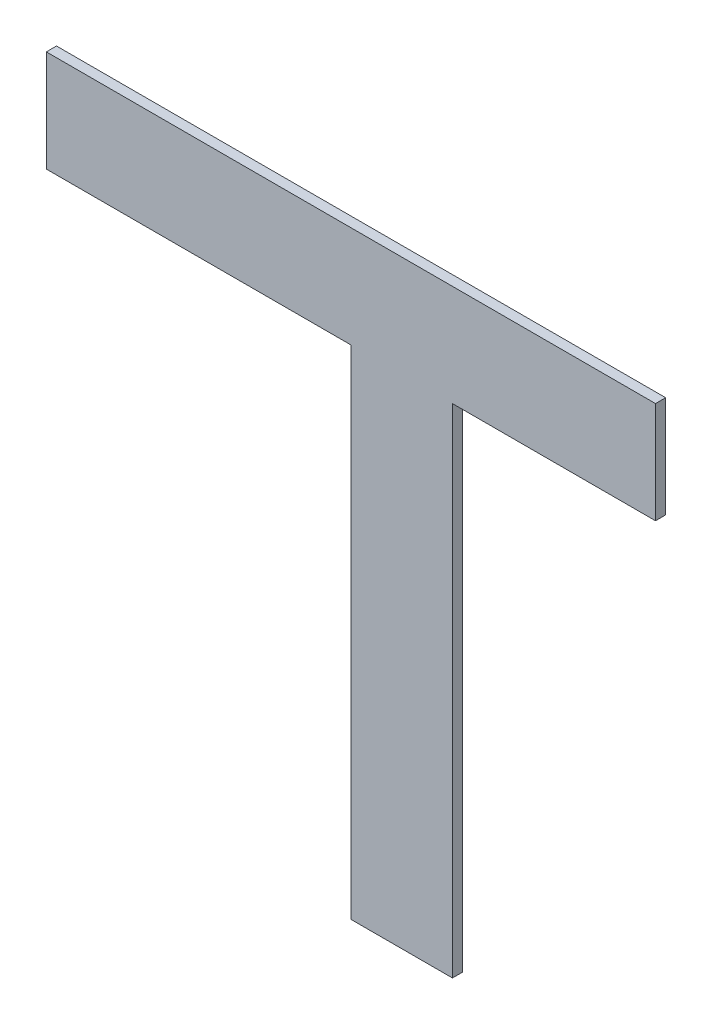
ISO-10303-21;
HEADER;
FILE_DESCRIPTION(('STEP AP214'),'2;1');
FILE_NAME('part.step','',(''),(''),'','','');
FILE_SCHEMA(('AUTOMOTIVE_DESIGN { 1 0 10303 214 1 1 1 1 }'));
ENDSEC;
DATA;
#1=APPLICATION_CONTEXT('core data for automotive mechanical design processes');
#2=APPLICATION_PROTOCOL_DEFINITION('international standard','automotive_design',2000,#1);
#3=PRODUCT_CONTEXT('',#1,'mechanical');
#4=PRODUCT('Part','Part','',(#3));
#5=PRODUCT_RELATED_PRODUCT_CATEGORY('part','',(#4));
#6=PRODUCT_DEFINITION_FORMATION('','',#4);
#7=PRODUCT_DEFINITION_CONTEXT('part definition',#1,'design');
#8=PRODUCT_DEFINITION('design','',#6,#7);
#9=PRODUCT_DEFINITION_SHAPE('','',#8);
#10=(LENGTH_UNIT() NAMED_UNIT(*) SI_UNIT(.MILLI.,.METRE.));
#11=(NAMED_UNIT(*) PLANE_ANGLE_UNIT() SI_UNIT($,.RADIAN.));
#12=(NAMED_UNIT(*) SI_UNIT($,.STERADIAN.) SOLID_ANGLE_UNIT());
#13=UNCERTAINTY_MEASURE_WITH_UNIT(LENGTH_MEASURE(1.E-05),#10,'distance_accuracy_value','');
#14=(GEOMETRIC_REPRESENTATION_CONTEXT(3) GLOBAL_UNCERTAINTY_ASSIGNED_CONTEXT((#13)) GLOBAL_UNIT_ASSIGNED_CONTEXT((#10,
#11,#12)) REPRESENTATION_CONTEXT('',''));
#15=CARTESIAN_POINT('',(0.,0.,0.));
#16=DIRECTION('',(0.,0.,1.));
#17=DIRECTION('',(1.,0.,0.));
#18=AXIS2_PLACEMENT_3D('',#15,#16,#17);
#19=CARTESIAN_POINT('',(0.,0.,1.27));
#20=DIRECTION('',(-1.,0.,0.));
#21=DIRECTION('',(0.,0.,1.));
#22=AXIS2_PLACEMENT_3D('',#19,#20,#21);
#23=PLANE('',#22);
#24=DIRECTION('',(0.,1.,0.));
#25=VECTOR('',#24,1.);
#26=CARTESIAN_POINT('',(0.,0.,-1.27));
#27=LINE('',#26,#25);
#28=CARTESIAN_POINT('',(0.,-124.46,-1.27));
#29=VERTEX_POINT('',#28);
#30=CARTESIAN_POINT('',(0.,0.,-1.27));
#31=VERTEX_POINT('',#30);
#32=EDGE_CURVE('E160',#29,#31,#27,.T.);
#33=ORIENTED_EDGE('',*,*,#32,.T.);
#34=DIRECTION('',(0.,0.,-1.));
#35=VECTOR('',#34,1.);
#36=CARTESIAN_POINT('',(0.,0.,1.27));
#37=LINE('',#36,#35);
#38=CARTESIAN_POINT('',(0.,0.,1.27));
#39=VERTEX_POINT('',#38);
#40=EDGE_CURVE('E11',#39,#31,#37,.T.);
#41=ORIENTED_EDGE('',*,*,#40,.F.);
#42=DIRECTION('',(0.,1.,0.));
#43=VECTOR('',#42,1.);
#44=CARTESIAN_POINT('',(0.,0.,1.27));
#45=LINE('',#44,#43);
#46=CARTESIAN_POINT('',(0.,-124.46,1.27));
#47=VERTEX_POINT('',#46);
#48=EDGE_CURVE('E90',#47,#39,#45,.T.);
#49=ORIENTED_EDGE('',*,*,#48,.F.);
#50=DIRECTION('',(0.,0.,-1.));
#51=VECTOR('',#50,1.);
#52=CARTESIAN_POINT('',(0.,-124.46,1.27));
#53=LINE('',#52,#51);
#54=EDGE_CURVE('E139',#47,#29,#53,.T.);
#55=ORIENTED_EDGE('',*,*,#54,.T.);
#56=EDGE_LOOP('',(#33,#41,#49,#55));
#57=FACE_BOUND('',#56,.T.);
#58=ADVANCED_FACE('F35',(#57),#23,.F.);
#59=CARTESIAN_POINT('',(0.,0.,1.27));
#60=DIRECTION('',(0.,-1.,0.));
#61=DIRECTION('',(1.,0.,0.));
#62=AXIS2_PLACEMENT_3D('',#59,#60,#61);
#63=PLANE('',#62);
#64=DIRECTION('',(-1.,0.,0.));
#65=VECTOR('',#64,1.);
#66=CARTESIAN_POINT('',(0.,0.,-1.27));
#67=LINE('',#66,#65);
#68=CARTESIAN_POINT('',(50.8,0.,-1.27));
#69=VERTEX_POINT('',#68);
#70=EDGE_CURVE('E155',#69,#31,#67,.T.);
#71=ORIENTED_EDGE('',*,*,#70,.F.);
#72=DIRECTION('',(0.,0.,-1.));
#73=VECTOR('',#72,1.);
#74=CARTESIAN_POINT('',(50.8,0.,1.27));
#75=LINE('',#74,#73);
#76=CARTESIAN_POINT('',(50.8,0.,1.27));
#77=VERTEX_POINT('',#76);
#78=EDGE_CURVE('E43',#77,#69,#75,.T.);
#79=ORIENTED_EDGE('',*,*,#78,.F.);
#80=DIRECTION('',(-1.,0.,0.));
#81=VECTOR('',#80,1.);
#82=CARTESIAN_POINT('',(0.,0.,1.27));
#83=LINE('',#82,#81);
#84=EDGE_CURVE('E126',#77,#39,#83,.T.);
#85=ORIENTED_EDGE('',*,*,#84,.T.);
#86=ORIENTED_EDGE('',*,*,#40,.T.);
#87=EDGE_LOOP('',(#71,#79,#85,#86));
#88=FACE_BOUND('',#87,.T.);
#89=ADVANCED_FACE('F156',(#88),#63,.T.);
#90=CARTESIAN_POINT('',(50.8,0.,1.27));
#91=DIRECTION('',(1.,0.,0.));
#92=DIRECTION('',(0.,0.,-1.));
#93=AXIS2_PLACEMENT_3D('',#90,#91,#92);
#94=PLANE('',#93);
#95=DIRECTION('',(0.,-1.,0.));
#96=VECTOR('',#95,1.);
#97=CARTESIAN_POINT('',(50.8,0.,-1.27));
#98=LINE('',#97,#96);
#99=CARTESIAN_POINT('',(50.8,25.4,-1.27));
#100=VERTEX_POINT('',#99);
#101=EDGE_CURVE('E151',#100,#69,#98,.T.);
#102=ORIENTED_EDGE('',*,*,#101,.F.);
#103=DIRECTION('',(0.,0.,-1.));
#104=VECTOR('',#103,1.);
#105=CARTESIAN_POINT('',(50.8,25.4,1.27));
#106=LINE('',#105,#104);
#107=CARTESIAN_POINT('',(50.8,25.4,1.27));
#108=VERTEX_POINT('',#107);
#109=EDGE_CURVE('E145',#108,#100,#106,.T.);
#110=ORIENTED_EDGE('',*,*,#109,.F.);
#111=DIRECTION('',(0.,-1.,0.));
#112=VECTOR('',#111,1.);
#113=CARTESIAN_POINT('',(50.8,0.,1.27));
#114=LINE('',#113,#112);
#115=EDGE_CURVE('E132',#108,#77,#114,.T.);
#116=ORIENTED_EDGE('',*,*,#115,.T.);
#117=ORIENTED_EDGE('',*,*,#78,.T.);
#118=EDGE_LOOP('',(#102,#110,#116,#117));
#119=FACE_BOUND('',#118,.T.);
#120=ADVANCED_FACE('F149',(#119),#94,.T.);
#121=CARTESIAN_POINT('',(0.,25.4,1.27));
#122=DIRECTION('',(0.,1.,0.));
#123=DIRECTION('',(-1.,0.,0.));
#124=AXIS2_PLACEMENT_3D('',#121,#122,#123);
#125=PLANE('',#124);
#126=DIRECTION('',(1.,0.,0.));
#127=VECTOR('',#126,1.);
#128=CARTESIAN_POINT('',(0.,25.4,-1.27));
#129=LINE('',#128,#127);
#130=CARTESIAN_POINT('',(-101.6,25.4,-1.27));
#131=VERTEX_POINT('',#130);
#132=EDGE_CURVE('E165',#131,#100,#129,.T.);
#133=ORIENTED_EDGE('',*,*,#132,.F.);
#134=DIRECTION('',(0.,0.,-1.));
#135=VECTOR('',#134,1.);
#136=CARTESIAN_POINT('',(-101.6,25.4,1.27));
#137=LINE('',#136,#135);
#138=CARTESIAN_POINT('',(-101.6,25.4,1.27));
#139=VERTEX_POINT('',#138);
#140=EDGE_CURVE('E143',#139,#131,#137,.T.);
#141=ORIENTED_EDGE('',*,*,#140,.F.);
#142=DIRECTION('',(1.,0.,0.));
#143=VECTOR('',#142,1.);
#144=CARTESIAN_POINT('',(0.,25.4,1.27));
#145=LINE('',#144,#143);
#146=EDGE_CURVE('E127',#139,#108,#145,.T.);
#147=ORIENTED_EDGE('',*,*,#146,.T.);
#148=ORIENTED_EDGE('',*,*,#109,.T.);
#149=EDGE_LOOP('',(#133,#141,#147,#148));
#150=FACE_BOUND('',#149,.T.);
#151=ADVANCED_FACE('F176',(#150),#125,.T.);
#152=CARTESIAN_POINT('',(-101.6,0.,1.27));
#153=DIRECTION('',(-1.,0.,0.));
#154=DIRECTION('',(0.,0.,1.));
#155=AXIS2_PLACEMENT_3D('',#152,#153,#154);
#156=PLANE('',#155);
#157=DIRECTION('',(0.,1.,0.));
#158=VECTOR('',#157,1.);
#159=CARTESIAN_POINT('',(-101.6,0.,-1.27));
#160=LINE('',#159,#158);
#161=CARTESIAN_POINT('',(-101.6,0.,-1.27));
#162=VERTEX_POINT('',#161);
#163=EDGE_CURVE('E167',#162,#131,#160,.T.);
#164=ORIENTED_EDGE('',*,*,#163,.F.);
#165=DIRECTION('',(0.,0.,-1.));
#166=VECTOR('',#165,1.);
#167=CARTESIAN_POINT('',(-101.6,0.,1.27));
#168=LINE('',#167,#166);
#169=CARTESIAN_POINT('',(-101.6,0.,1.27));
#170=VERTEX_POINT('',#169);
#171=EDGE_CURVE('E114',#170,#162,#168,.T.);
#172=ORIENTED_EDGE('',*,*,#171,.F.);
#173=DIRECTION('',(0.,1.,0.));
#174=VECTOR('',#173,1.);
#175=CARTESIAN_POINT('',(-101.6,0.,1.27));
#176=LINE('',#175,#174);
#177=EDGE_CURVE('E124',#170,#139,#176,.T.);
#178=ORIENTED_EDGE('',*,*,#177,.T.);
#179=ORIENTED_EDGE('',*,*,#140,.T.);
#180=EDGE_LOOP('',(#164,#172,#178,#179));
#181=FACE_BOUND('',#180,.T.);
#182=ADVANCED_FACE('F178',(#181),#156,.T.);
#183=CARTESIAN_POINT('',(-25.4,0.,-1.27));
#184=VERTEX_POINT('',#183);
#185=EDGE_CURVE('E113',#184,#162,#67,.T.);
#186=ORIENTED_EDGE('',*,*,#185,.F.);
#187=DIRECTION('',(0.,0.,-1.));
#188=VECTOR('',#187,1.);
#189=CARTESIAN_POINT('',(-25.4,0.,1.27));
#190=LINE('',#189,#188);
#191=CARTESIAN_POINT('',(-25.4,0.,1.27));
#192=VERTEX_POINT('',#191);
#193=EDGE_CURVE('E107',#192,#184,#190,.T.);
#194=ORIENTED_EDGE('',*,*,#193,.F.);
#195=EDGE_CURVE('E111',#192,#170,#83,.T.);
#196=ORIENTED_EDGE('',*,*,#195,.T.);
#197=ORIENTED_EDGE('',*,*,#171,.T.);
#198=EDGE_LOOP('',(#186,#194,#196,#197));
#199=FACE_BOUND('',#198,.T.);
#200=ADVANCED_FACE('F109',(#199),#63,.T.);
#201=CARTESIAN_POINT('',(-25.4,0.,1.27));
#202=DIRECTION('',(1.,0.,0.));
#203=DIRECTION('',(0.,1.,0.));
#204=AXIS2_PLACEMENT_3D('',#201,#202,#203);
#205=PLANE('',#204);
#206=DIRECTION('',(0.,-1.,0.));
#207=VECTOR('',#206,1.);
#208=CARTESIAN_POINT('',(-25.4,0.,-1.27));
#209=LINE('',#208,#207);
#210=CARTESIAN_POINT('',(-25.4,-124.46,-1.27));
#211=VERTEX_POINT('',#210);
#212=EDGE_CURVE('E78',#184,#211,#209,.T.);
#213=ORIENTED_EDGE('',*,*,#212,.T.);
#214=DIRECTION('',(0.,0.,-1.));
#215=VECTOR('',#214,1.);
#216=CARTESIAN_POINT('',(-25.4,-124.46,1.27));
#217=LINE('',#216,#215);
#218=CARTESIAN_POINT('',(-25.4,-124.46,1.27));
#219=VERTEX_POINT('',#218);
#220=EDGE_CURVE('E115',#219,#211,#217,.T.);
#221=ORIENTED_EDGE('',*,*,#220,.F.);
#222=DIRECTION('',(0.,-1.,0.));
#223=VECTOR('',#222,1.);
#224=CARTESIAN_POINT('',(-25.4,0.,1.27));
#225=LINE('',#224,#223);
#226=EDGE_CURVE('E117',#192,#219,#225,.T.);
#227=ORIENTED_EDGE('',*,*,#226,.F.);
#228=ORIENTED_EDGE('',*,*,#193,.T.);
#229=EDGE_LOOP('',(#213,#221,#227,#228));
#230=FACE_BOUND('',#229,.T.);
#231=ADVANCED_FACE('F118',(#230),#205,.F.);
#232=CARTESIAN_POINT('',(0.,-124.46,1.27));
#233=DIRECTION('',(0.,1.,0.));
#234=DIRECTION('',(0.,0.,1.));
#235=AXIS2_PLACEMENT_3D('',#232,#233,#234);
#236=PLANE('',#235);
#237=DIRECTION('',(1.,0.,0.));
#238=VECTOR('',#237,1.);
#239=CARTESIAN_POINT('',(0.,-124.46,-1.27));
#240=LINE('',#239,#238);
#241=EDGE_CURVE('E84',#211,#29,#240,.T.);
#242=ORIENTED_EDGE('',*,*,#241,.T.);
#243=ORIENTED_EDGE('',*,*,#54,.F.);
#244=DIRECTION('',(1.,0.,0.));
#245=VECTOR('',#244,1.);
#246=CARTESIAN_POINT('',(0.,-124.46,1.27));
#247=LINE('',#246,#245);
#248=EDGE_CURVE('E51',#219,#47,#247,.T.);
#249=ORIENTED_EDGE('',*,*,#248,.F.);
#250=ORIENTED_EDGE('',*,*,#220,.T.);
#251=EDGE_LOOP('',(#242,#243,#249,#250));
#252=FACE_BOUND('',#251,.T.);
#253=ADVANCED_FACE('F197',(#252),#236,.F.);
#254=CARTESIAN_POINT('',(0.,0.,1.27));
#255=DIRECTION('',(0.,0.,1.));
#256=DIRECTION('',(1.,0.,0.));
#257=AXIS2_PLACEMENT_3D('',#254,#255,#256);
#258=PLANE('',#257);
#259=ORIENTED_EDGE('',*,*,#48,.T.);
#260=ORIENTED_EDGE('',*,*,#84,.F.);
#261=ORIENTED_EDGE('',*,*,#115,.F.);
#262=ORIENTED_EDGE('',*,*,#146,.F.);
#263=ORIENTED_EDGE('',*,*,#177,.F.);
#264=ORIENTED_EDGE('',*,*,#195,.F.);
#265=ORIENTED_EDGE('',*,*,#226,.T.);
#266=ORIENTED_EDGE('',*,*,#248,.T.);
#267=EDGE_LOOP('',(#259,#260,#261,#262,#263,#264,#265,#266));
#268=FACE_BOUND('',#267,.T.);
#269=ADVANCED_FACE('F121',(#268),#258,.T.);
#270=CARTESIAN_POINT('',(0.,0.,-1.27));
#271=DIRECTION('',(0.,0.,1.));
#272=DIRECTION('',(1.,0.,0.));
#273=AXIS2_PLACEMENT_3D('',#270,#271,#272);
#274=PLANE('',#273);
#275=ORIENTED_EDGE('',*,*,#32,.F.);
#276=ORIENTED_EDGE('',*,*,#241,.F.);
#277=ORIENTED_EDGE('',*,*,#212,.F.);
#278=ORIENTED_EDGE('',*,*,#185,.T.);
#279=ORIENTED_EDGE('',*,*,#163,.T.);
#280=ORIENTED_EDGE('',*,*,#132,.T.);
#281=ORIENTED_EDGE('',*,*,#101,.T.);
#282=ORIENTED_EDGE('',*,*,#70,.T.);
#283=EDGE_LOOP('',(#275,#276,#277,#278,#279,#280,#281,#282));
#284=FACE_BOUND('',#283,.T.);
#285=ADVANCED_FACE('F162',(#284),#274,.F.);
#286=CLOSED_SHELL('',(#58,#89,#120,#151,#182,#200,#231,#253,#269,#285));
#287=MANIFOLD_SOLID_BREP('B2',#286);
#288=ADVANCED_BREP_SHAPE_REPRESENTATION('',(#18,#287),#14);
#289=SHAPE_DEFINITION_REPRESENTATION(#9,#288);
ENDSEC;
END-ISO-10303-21;
